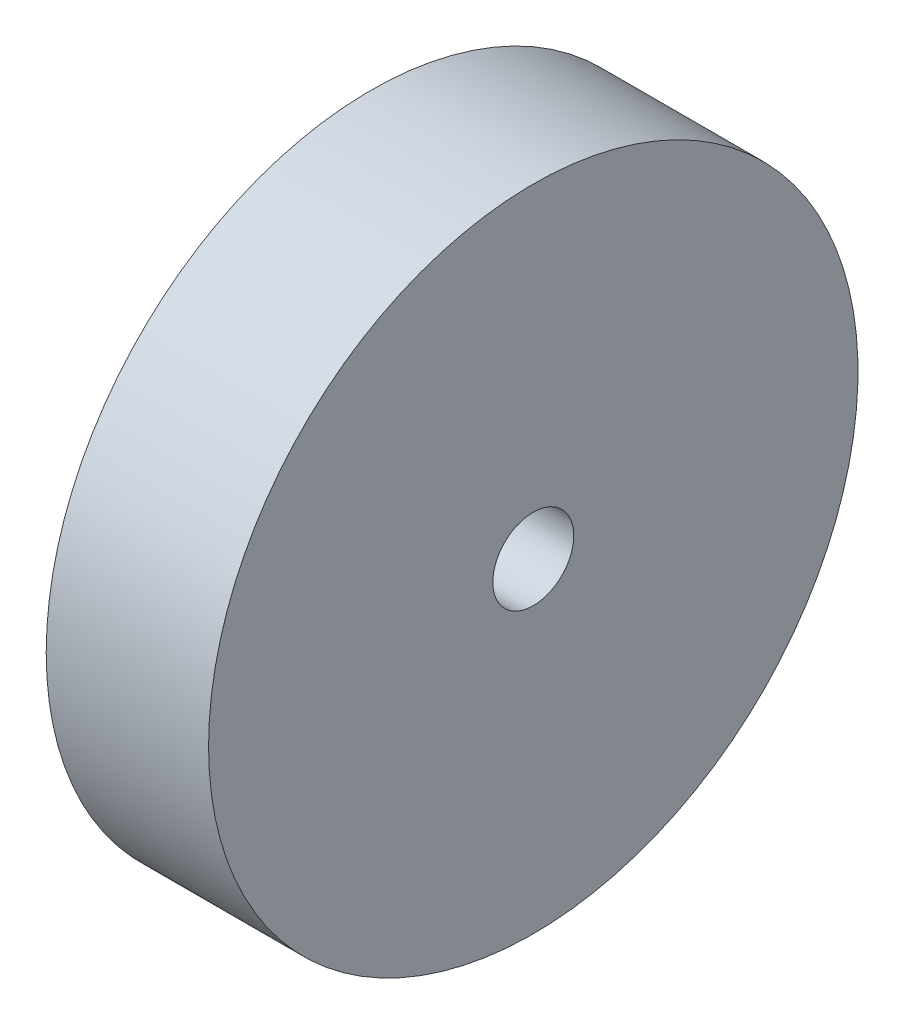
ISO-10303-21;
HEADER;
FILE_DESCRIPTION(('STEP AP214'),'2;1');
FILE_NAME('part.step','',(''),(''),'','','');
FILE_SCHEMA(('AUTOMOTIVE_DESIGN { 1 0 10303 214 1 1 1 1 }'));
ENDSEC;
DATA;
#1=APPLICATION_CONTEXT('core data for automotive mechanical design processes');
#2=APPLICATION_PROTOCOL_DEFINITION('international standard','automotive_design',2000,#1);
#3=PRODUCT_CONTEXT('',#1,'mechanical');
#4=PRODUCT('Part','Part','',(#3));
#5=PRODUCT_RELATED_PRODUCT_CATEGORY('part','',(#4));
#6=PRODUCT_DEFINITION_FORMATION('','',#4);
#7=PRODUCT_DEFINITION_CONTEXT('part definition',#1,'design');
#8=PRODUCT_DEFINITION('design','',#6,#7);
#9=PRODUCT_DEFINITION_SHAPE('','',#8);
#10=(LENGTH_UNIT() NAMED_UNIT(*) SI_UNIT(.MILLI.,.METRE.));
#11=(NAMED_UNIT(*) PLANE_ANGLE_UNIT() SI_UNIT($,.RADIAN.));
#12=(NAMED_UNIT(*) SI_UNIT($,.STERADIAN.) SOLID_ANGLE_UNIT());
#13=UNCERTAINTY_MEASURE_WITH_UNIT(LENGTH_MEASURE(1.E-05),#10,'distance_accuracy_value','');
#14=(GEOMETRIC_REPRESENTATION_CONTEXT(3) GLOBAL_UNCERTAINTY_ASSIGNED_CONTEXT((#13)) GLOBAL_UNIT_ASSIGNED_CONTEXT((#10,
#11,#12)) REPRESENTATION_CONTEXT('',''));
#15=CARTESIAN_POINT('',(0.,0.,0.));
#16=DIRECTION('',(0.,0.,1.));
#17=DIRECTION('',(1.,0.,0.));
#18=AXIS2_PLACEMENT_3D('',#15,#16,#17);
#19=CARTESIAN_POINT('',(76.2,0.,0.));
#20=DIRECTION('',(-1.,0.,0.));
#21=DIRECTION('',(0.,0.,1.));
#22=AXIS2_PLACEMENT_3D('',#19,#20,#21);
#23=CYLINDRICAL_SURFACE('',#22,152.4);
#24=CARTESIAN_POINT('',(76.2,0.,0.));
#25=DIRECTION('',(1.,0.,0.));
#26=DIRECTION('',(0.,0.,-1.));
#27=AXIS2_PLACEMENT_3D('',#24,#25,#26);
#28=CIRCLE('',#27,152.4);
#29=CARTESIAN_POINT('',(76.2,0.,152.4));
#30=VERTEX_POINT('',#29);
#31=EDGE_CURVE('E10',#30,#30,#28,.T.);
#32=CARTESIAN_POINT('',(0.,0.,0.));
#33=DIRECTION('',(1.,0.,0.));
#34=DIRECTION('',(0.,0.,-1.));
#35=AXIS2_PLACEMENT_3D('',#32,#33,#34);
#36=CIRCLE('',#35,152.4);
#37=CARTESIAN_POINT('',(0.,0.,152.4));
#38=VERTEX_POINT('',#37);
#39=EDGE_CURVE('E38',#38,#38,#36,.T.);
#40=CARTESIAN_POINT('',(76.2,0.,152.4));
#41=CARTESIAN_POINT('',(75.40625,0.,152.4));
#42=CARTESIAN_POINT('',(74.6125,0.,152.4));
#43=CARTESIAN_POINT('',(73.025,0.,152.4));
#44=CARTESIAN_POINT('',(72.23125,0.,152.4));
#45=CARTESIAN_POINT('',(70.64375,0.,152.4));
#46=CARTESIAN_POINT('',(69.85,0.,152.4));
#47=CARTESIAN_POINT('',(68.2625,0.,152.4));
#48=CARTESIAN_POINT('',(67.46875,0.,152.4));
#49=CARTESIAN_POINT('',(65.88125,0.,152.4));
#50=CARTESIAN_POINT('',(65.0875,0.,152.4));
#51=CARTESIAN_POINT('',(63.5,0.,152.4));
#52=CARTESIAN_POINT('',(62.70625,0.,152.4));
#53=CARTESIAN_POINT('',(61.11875,0.,152.4));
#54=CARTESIAN_POINT('',(60.325,0.,152.4));
#55=CARTESIAN_POINT('',(58.7375,0.,152.4));
#56=CARTESIAN_POINT('',(57.94375,0.,152.4));
#57=CARTESIAN_POINT('',(56.35625,0.,152.4));
#58=CARTESIAN_POINT('',(55.5625,0.,152.4));
#59=CARTESIAN_POINT('',(53.975,0.,152.4));
#60=CARTESIAN_POINT('',(53.18125,0.,152.4));
#61=CARTESIAN_POINT('',(51.59375,0.,152.4));
#62=CARTESIAN_POINT('',(50.8,0.,152.4));
#63=CARTESIAN_POINT('',(49.2125,0.,152.4));
#64=CARTESIAN_POINT('',(48.41875,0.,152.4));
#65=CARTESIAN_POINT('',(46.83125,0.,152.4));
#66=CARTESIAN_POINT('',(46.0375,0.,152.4));
#67=CARTESIAN_POINT('',(44.45,0.,152.4));
#68=CARTESIAN_POINT('',(43.65625,0.,152.4));
#69=CARTESIAN_POINT('',(42.06875,0.,152.4));
#70=CARTESIAN_POINT('',(41.275,0.,152.4));
#71=CARTESIAN_POINT('',(39.6875,0.,152.4));
#72=CARTESIAN_POINT('',(38.89375,0.,152.4));
#73=CARTESIAN_POINT('',(37.30625,0.,152.4));
#74=CARTESIAN_POINT('',(36.5125,0.,152.4));
#75=CARTESIAN_POINT('',(34.925,0.,152.4));
#76=CARTESIAN_POINT('',(34.13125,0.,152.4));
#77=CARTESIAN_POINT('',(32.54375,0.,152.4));
#78=CARTESIAN_POINT('',(31.75,0.,152.4));
#79=CARTESIAN_POINT('',(30.1625,0.,152.4));
#80=CARTESIAN_POINT('',(29.36875,0.,152.4));
#81=CARTESIAN_POINT('',(27.78125,0.,152.4));
#82=CARTESIAN_POINT('',(26.9875,0.,152.4));
#83=CARTESIAN_POINT('',(25.4,0.,152.4));
#84=CARTESIAN_POINT('',(24.60625,0.,152.4));
#85=CARTESIAN_POINT('',(23.01875,0.,152.4));
#86=CARTESIAN_POINT('',(22.225,0.,152.4));
#87=CARTESIAN_POINT('',(20.6375,0.,152.4));
#88=CARTESIAN_POINT('',(19.84375,0.,152.4));
#89=CARTESIAN_POINT('',(18.25625,0.,152.4));
#90=CARTESIAN_POINT('',(17.4625,0.,152.4));
#91=CARTESIAN_POINT('',(15.875,0.,152.4));
#92=CARTESIAN_POINT('',(15.08125,0.,152.4));
#93=CARTESIAN_POINT('',(13.49375,0.,152.4));
#94=CARTESIAN_POINT('',(12.7,0.,152.4));
#95=CARTESIAN_POINT('',(11.1125,0.,152.4));
#96=CARTESIAN_POINT('',(10.31875,0.,152.4));
#97=CARTESIAN_POINT('',(8.73125,0.,152.4));
#98=CARTESIAN_POINT('',(7.93750000000001,0.,152.4));
#99=CARTESIAN_POINT('',(6.35,0.,152.4));
#100=CARTESIAN_POINT('',(5.55625,0.,152.4));
#101=CARTESIAN_POINT('',(3.96875,0.,152.4));
#102=CARTESIAN_POINT('',(3.175,0.,152.4));
#103=CARTESIAN_POINT('',(1.5875,0.,152.4));
#104=CARTESIAN_POINT('',(0.793750000000001,0.,152.4));
#105=CARTESIAN_POINT('',(0.,0.,152.4));
#106=B_SPLINE_CURVE_WITH_KNOTS('',3,(#40,#41,#42,#43,#44,#45,#46,#47,#48,#49,#50,#51,#52,#53,
#54,#55,#56,#57,#58,#59,#60,#61,#62,#63,#64,#65,#66,#67,#68,#69,#70,#71,#72,#73,#74,#75,#76,#77,
#78,#79,#80,#81,#82,#83,#84,#85,#86,#87,#88,#89,#90,#91,#92,#93,#94,#95,#96,#97,#98,#99,#100,
#101,#102,#103,#104,#105),.UNSPECIFIED.,.F.,.F.,(4,2,2,2,2,2,2,2,2,2,2,2,2,2,2,2,2,2,2,2,2,2,2,
2,2,2,2,2,2,2,2,2,4),(0.,2.38125,4.7625,7.14375,9.52500000000001,11.90625,14.2875,16.66875,
19.05,21.43125,23.8125,26.19375,28.575,30.95625,33.3375,35.71875,38.1,40.48125,42.8625,45.24375,
47.625,50.00625,52.3875,54.76875,57.15,59.53125,61.9125,64.29375,66.675,69.05625,71.4375,
73.81875,76.2),.UNSPECIFIED.);
#107=EDGE_CURVE('BSEAM35',#30,#38,#106,.T.);
#108=ORIENTED_EDGE('',*,*,#31,.F.);
#109=ORIENTED_EDGE('',*,*,#39,.T.);
#110=ORIENTED_EDGE('',*,*,#107,.T.);
#111=ORIENTED_EDGE('',*,*,#107,.F.);
#112=EDGE_LOOP('',(#108,#110,#109,#111));
#113=FACE_BOUND('',#112,.T.);
#114=ADVANCED_FACE('F35',(#113),#23,.T.);
#115=CARTESIAN_POINT('',(76.2,0.,0.));
#116=DIRECTION('',(1.,0.,0.));
#117=DIRECTION('',(0.,0.,-1.));
#118=AXIS2_PLACEMENT_3D('',#115,#116,#117);
#119=PLANE('',#118);
#120=CARTESIAN_POINT('',(76.2,0.,0.));
#121=DIRECTION('',(1.,0.,0.));
#122=DIRECTION('',(0.,0.,-1.));
#123=AXIS2_PLACEMENT_3D('',#120,#121,#122);
#124=CIRCLE('',#123,18.999962);
#125=CARTESIAN_POINT('',(76.2,0.,-18.999962));
#126=VERTEX_POINT('',#125);
#127=EDGE_CURVE('E47',#126,#126,#124,.T.);
#128=ORIENTED_EDGE('',*,*,#127,.F.);
#129=EDGE_LOOP('',(#128));
#130=FACE_BOUND('',#129,.T.);
#131=ORIENTED_EDGE('',*,*,#31,.T.);
#132=EDGE_LOOP('',(#131));
#133=FACE_BOUND('',#132,.T.);
#134=ADVANCED_FACE('F62',(#130,#133),#119,.T.);
#135=CARTESIAN_POINT('',(0.,0.,0.));
#136=DIRECTION('',(1.,0.,0.));
#137=DIRECTION('',(0.,0.,-1.));
#138=AXIS2_PLACEMENT_3D('',#135,#136,#137);
#139=PLANE('',#138);
#140=CARTESIAN_POINT('',(0.,0.,0.));
#141=DIRECTION('',(1.,0.,0.));
#142=DIRECTION('',(0.,0.,-1.));
#143=AXIS2_PLACEMENT_3D('',#140,#141,#142);
#144=CIRCLE('',#143,18.999962);
#145=CARTESIAN_POINT('',(0.,0.,-18.999962));
#146=VERTEX_POINT('',#145);
#147=EDGE_CURVE('E45',#146,#146,#144,.T.);
#148=ORIENTED_EDGE('',*,*,#147,.T.);
#149=EDGE_LOOP('',(#148));
#150=FACE_BOUND('',#149,.T.);
#151=ORIENTED_EDGE('',*,*,#39,.F.);
#152=EDGE_LOOP('',(#151));
#153=FACE_BOUND('',#152,.T.);
#154=ADVANCED_FACE('F53',(#150,#153),#139,.F.);
#155=CARTESIAN_POINT('',(0.,0.,0.));
#156=DIRECTION('',(1.,0.,0.));
#157=DIRECTION('',(0.,0.,-1.));
#158=AXIS2_PLACEMENT_3D('',#155,#156,#157);
#159=CYLINDRICAL_SURFACE('',#158,18.999962);
#160=CARTESIAN_POINT('',(0.,0.,-18.999962));
#161=CARTESIAN_POINT('',(0.79375,0.,-18.999962));
#162=CARTESIAN_POINT('',(1.5875,0.,-18.999962));
#163=CARTESIAN_POINT('',(3.175,0.,-18.999962));
#164=CARTESIAN_POINT('',(3.96875,0.,-18.999962));
#165=CARTESIAN_POINT('',(5.55625,0.,-18.999962));
#166=CARTESIAN_POINT('',(6.35,0.,-18.999962));
#167=CARTESIAN_POINT('',(7.9375,0.,-18.999962));
#168=CARTESIAN_POINT('',(8.73125,0.,-18.999962));
#169=CARTESIAN_POINT('',(10.31875,0.,-18.999962));
#170=CARTESIAN_POINT('',(11.1125,0.,-18.999962));
#171=CARTESIAN_POINT('',(12.7,0.,-18.999962));
#172=CARTESIAN_POINT('',(13.49375,0.,-18.999962));
#173=CARTESIAN_POINT('',(15.08125,0.,-18.999962));
#174=CARTESIAN_POINT('',(15.875,0.,-18.999962));
#175=CARTESIAN_POINT('',(17.4625,0.,-18.999962));
#176=CARTESIAN_POINT('',(18.25625,0.,-18.999962));
#177=CARTESIAN_POINT('',(19.84375,0.,-18.999962));
#178=CARTESIAN_POINT('',(20.6375,0.,-18.999962));
#179=CARTESIAN_POINT('',(22.225,0.,-18.999962));
#180=CARTESIAN_POINT('',(23.01875,0.,-18.999962));
#181=CARTESIAN_POINT('',(24.60625,0.,-18.999962));
#182=CARTESIAN_POINT('',(25.4,0.,-18.999962));
#183=CARTESIAN_POINT('',(26.9875,0.,-18.999962));
#184=CARTESIAN_POINT('',(27.78125,0.,-18.999962));
#185=CARTESIAN_POINT('',(29.36875,0.,-18.999962));
#186=CARTESIAN_POINT('',(30.1625,0.,-18.999962));
#187=CARTESIAN_POINT('',(31.75,0.,-18.999962));
#188=CARTESIAN_POINT('',(32.54375,0.,-18.999962));
#189=CARTESIAN_POINT('',(34.13125,0.,-18.999962));
#190=CARTESIAN_POINT('',(34.925,0.,-18.999962));
#191=CARTESIAN_POINT('',(36.5125,0.,-18.999962));
#192=CARTESIAN_POINT('',(37.30625,0.,-18.999962));
#193=CARTESIAN_POINT('',(38.89375,0.,-18.999962));
#194=CARTESIAN_POINT('',(39.6875,0.,-18.999962));
#195=CARTESIAN_POINT('',(41.275,0.,-18.999962));
#196=CARTESIAN_POINT('',(42.06875,0.,-18.999962));
#197=CARTESIAN_POINT('',(43.65625,0.,-18.999962));
#198=CARTESIAN_POINT('',(44.45,0.,-18.999962));
#199=CARTESIAN_POINT('',(46.0375,0.,-18.999962));
#200=CARTESIAN_POINT('',(46.83125,0.,-18.999962));
#201=CARTESIAN_POINT('',(48.41875,0.,-18.999962));
#202=CARTESIAN_POINT('',(49.2125,0.,-18.999962));
#203=CARTESIAN_POINT('',(50.8,0.,-18.999962));
#204=CARTESIAN_POINT('',(51.59375,0.,-18.999962));
#205=CARTESIAN_POINT('',(53.18125,0.,-18.999962));
#206=CARTESIAN_POINT('',(53.975,0.,-18.999962));
#207=CARTESIAN_POINT('',(55.5625,0.,-18.999962));
#208=CARTESIAN_POINT('',(56.35625,0.,-18.999962));
#209=CARTESIAN_POINT('',(57.94375,0.,-18.999962));
#210=CARTESIAN_POINT('',(58.7375,0.,-18.999962));
#211=CARTESIAN_POINT('',(60.325,0.,-18.999962));
#212=CARTESIAN_POINT('',(61.11875,0.,-18.999962));
#213=CARTESIAN_POINT('',(62.70625,0.,-18.999962));
#214=CARTESIAN_POINT('',(63.5,0.,-18.999962));
#215=CARTESIAN_POINT('',(65.0875,0.,-18.999962));
#216=CARTESIAN_POINT('',(65.88125,0.,-18.999962));
#217=CARTESIAN_POINT('',(67.46875,0.,-18.999962));
#218=CARTESIAN_POINT('',(68.2625,0.,-18.999962));
#219=CARTESIAN_POINT('',(69.85,0.,-18.999962));
#220=CARTESIAN_POINT('',(70.64375,0.,-18.999962));
#221=CARTESIAN_POINT('',(72.23125,0.,-18.999962));
#222=CARTESIAN_POINT('',(73.025,0.,-18.999962));
#223=CARTESIAN_POINT('',(74.6125,0.,-18.999962));
#224=CARTESIAN_POINT('',(75.40625,0.,-18.999962));
#225=CARTESIAN_POINT('',(76.2,0.,-18.999962));
#226=B_SPLINE_CURVE_WITH_KNOTS('',3,(#160,#161,#162,#163,#164,#165,#166,#167,#168,#169,#170,
#171,#172,#173,#174,#175,#176,#177,#178,#179,#180,#181,#182,#183,#184,#185,#186,#187,#188,#189,
#190,#191,#192,#193,#194,#195,#196,#197,#198,#199,#200,#201,#202,#203,#204,#205,#206,#207,#208,
#209,#210,#211,#212,#213,#214,#215,#216,#217,#218,#219,#220,#221,#222,#223,#224,#225),
.UNSPECIFIED.,.F.,.F.,(4,2,2,2,2,2,2,2,2,2,2,2,2,2,2,2,2,2,2,2,2,2,2,2,2,2,2,2,2,2,2,2,4),(0.,
2.38125,4.7625,7.14375,9.525,11.90625,14.2875,16.66875,19.05,21.43125,23.8125,26.19375,28.575,
30.95625,33.3375,35.71875,38.1,40.48125,42.8625,45.24375,47.625,50.00625,52.3875,54.76875,57.15,
59.53125,61.9125,64.29375,66.675,69.05625,71.4375,73.81875,76.2),.UNSPECIFIED.);
#227=EDGE_CURVE('BSEAM56',#146,#126,#226,.T.);
#228=ORIENTED_EDGE('',*,*,#147,.F.);
#229=ORIENTED_EDGE('',*,*,#127,.T.);
#230=ORIENTED_EDGE('',*,*,#227,.T.);
#231=ORIENTED_EDGE('',*,*,#227,.F.);
#232=EDGE_LOOP('',(#228,#230,#229,#231));
#233=FACE_BOUND('',#232,.T.);
#234=ADVANCED_FACE('F56',(#233),#159,.F.);
#235=CLOSED_SHELL('',(#114,#134,#154,#234));
#236=MANIFOLD_SOLID_BREP('B2',#235);
#237=ADVANCED_BREP_SHAPE_REPRESENTATION('',(#18,#236),#14);
#238=SHAPE_DEFINITION_REPRESENTATION(#9,#237);
ENDSEC;
END-ISO-10303-21;
